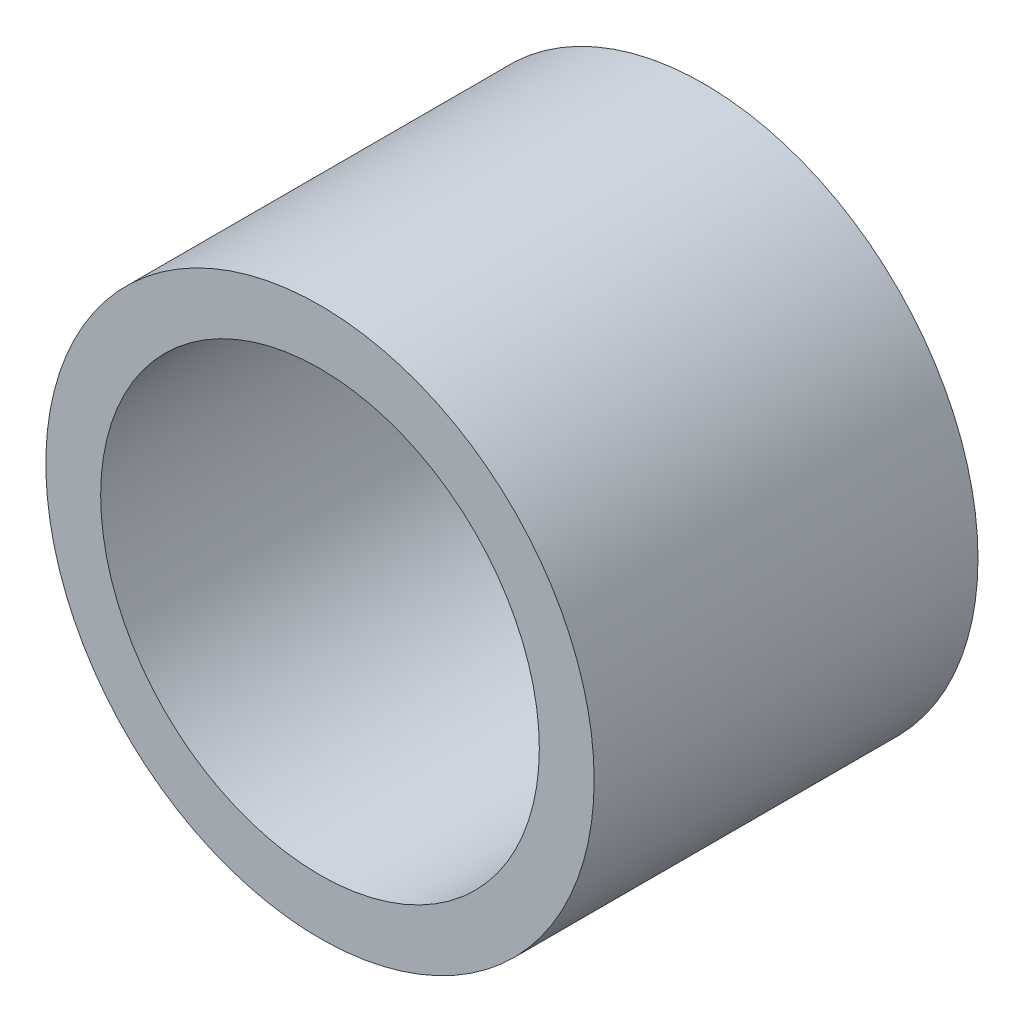
ISO-10303-21;
HEADER;
FILE_DESCRIPTION(('STEP AP214'),'2;1');
FILE_NAME('part.step','',(''),(''),'','','');
FILE_SCHEMA(('AUTOMOTIVE_DESIGN { 1 0 10303 214 1 1 1 1 }'));
ENDSEC;
DATA;
#1=APPLICATION_CONTEXT('core data for automotive mechanical design processes');
#2=APPLICATION_PROTOCOL_DEFINITION('international standard','automotive_design',2000,#1);
#3=PRODUCT_CONTEXT('',#1,'mechanical');
#4=PRODUCT('Part','Part','',(#3));
#5=PRODUCT_RELATED_PRODUCT_CATEGORY('part','',(#4));
#6=PRODUCT_DEFINITION_FORMATION('','',#4);
#7=PRODUCT_DEFINITION_CONTEXT('part definition',#1,'design');
#8=PRODUCT_DEFINITION('design','',#6,#7);
#9=PRODUCT_DEFINITION_SHAPE('','',#8);
#10=(LENGTH_UNIT() NAMED_UNIT(*) SI_UNIT(.MILLI.,.METRE.));
#11=(NAMED_UNIT(*) PLANE_ANGLE_UNIT() SI_UNIT($,.RADIAN.));
#12=(NAMED_UNIT(*) SI_UNIT($,.STERADIAN.) SOLID_ANGLE_UNIT());
#13=UNCERTAINTY_MEASURE_WITH_UNIT(LENGTH_MEASURE(1.E-05),#10,'distance_accuracy_value','');
#14=(GEOMETRIC_REPRESENTATION_CONTEXT(3) GLOBAL_UNCERTAINTY_ASSIGNED_CONTEXT((#13)) GLOBAL_UNIT_ASSIGNED_CONTEXT((#10,
#11,#12)) REPRESENTATION_CONTEXT('',''));
#15=CARTESIAN_POINT('',(0.,0.,0.));
#16=DIRECTION('',(0.,0.,1.));
#17=DIRECTION('',(1.,0.,0.));
#18=AXIS2_PLACEMENT_3D('',#15,#16,#17);
#19=CARTESIAN_POINT('',(0.,0.,7.));
#20=DIRECTION('',(0.,0.,1.));
#21=DIRECTION('',(1.,0.,0.));
#22=AXIS2_PLACEMENT_3D('',#19,#20,#21);
#23=PLANE('',#22);
#24=CARTESIAN_POINT('',(0.,0.,7.));
#25=DIRECTION('',(0.,0.,1.));
#26=DIRECTION('',(1.,0.,0.));
#27=AXIS2_PLACEMENT_3D('',#24,#25,#26);
#28=CIRCLE('',#27,5.);
#29=CARTESIAN_POINT('',(5.,0.,7.));
#30=VERTEX_POINT('',#29);
#31=EDGE_CURVE('E10',#30,#30,#28,.T.);
#32=ORIENTED_EDGE('',*,*,#31,.T.);
#33=EDGE_LOOP('',(#32));
#34=FACE_BOUND('',#33,.T.);
#35=CARTESIAN_POINT('',(0.,0.,7.));
#36=DIRECTION('',(0.,0.,1.));
#37=DIRECTION('',(1.,0.,0.));
#38=AXIS2_PLACEMENT_3D('',#35,#36,#37);
#39=CIRCLE('',#38,4.);
#40=CARTESIAN_POINT('',(4.,0.,7.));
#41=VERTEX_POINT('',#40);
#42=EDGE_CURVE('E57',#41,#41,#39,.T.);
#43=ORIENTED_EDGE('',*,*,#42,.F.);
#44=EDGE_LOOP('',(#43));
#45=FACE_BOUND('',#44,.T.);
#46=ADVANCED_FACE('F43',(#34,#45),#23,.T.);
#47=CARTESIAN_POINT('',(0.,0.,0.));
#48=DIRECTION('',(0.,0.,1.));
#49=DIRECTION('',(1.,0.,0.));
#50=AXIS2_PLACEMENT_3D('',#47,#48,#49);
#51=PLANE('',#50);
#52=CARTESIAN_POINT('',(0.,0.,0.));
#53=DIRECTION('',(0.,0.,1.));
#54=DIRECTION('',(1.,0.,0.));
#55=AXIS2_PLACEMENT_3D('',#52,#53,#54);
#56=CIRCLE('',#55,5.);
#57=CARTESIAN_POINT('',(5.,0.,0.));
#58=VERTEX_POINT('',#57);
#59=EDGE_CURVE('E50',#58,#58,#56,.T.);
#60=ORIENTED_EDGE('',*,*,#59,.F.);
#61=EDGE_LOOP('',(#60));
#62=FACE_BOUND('',#61,.T.);
#63=CARTESIAN_POINT('',(0.,0.,0.));
#64=DIRECTION('',(0.,0.,1.));
#65=DIRECTION('',(1.,0.,0.));
#66=AXIS2_PLACEMENT_3D('',#63,#64,#65);
#67=CIRCLE('',#66,4.);
#68=CARTESIAN_POINT('',(4.,0.,0.));
#69=VERTEX_POINT('',#68);
#70=EDGE_CURVE('E59',#69,#69,#67,.T.);
#71=ORIENTED_EDGE('',*,*,#70,.T.);
#72=EDGE_LOOP('',(#71));
#73=FACE_BOUND('',#72,.T.);
#74=ADVANCED_FACE('F68',(#62,#73),#51,.F.);
#75=CARTESIAN_POINT('',(0.,0.,7.));
#76=DIRECTION('',(0.,0.,-1.));
#77=DIRECTION('',(-1.,0.,0.));
#78=AXIS2_PLACEMENT_3D('',#75,#76,#77);
#79=CYLINDRICAL_SURFACE('',#78,5.);
#80=ORIENTED_EDGE('',*,*,#31,.F.);
#81=EDGE_LOOP('',(#80));
#82=FACE_BOUND('',#81,.T.);
#83=ORIENTED_EDGE('',*,*,#59,.T.);
#84=EDGE_LOOP('',(#83));
#85=FACE_BOUND('',#84,.T.);
#86=ADVANCED_FACE('F44',(#82,#85),#79,.T.);
#87=CARTESIAN_POINT('',(0.,0.,7.));
#88=DIRECTION('',(0.,0.,-1.));
#89=DIRECTION('',(-1.,0.,0.));
#90=AXIS2_PLACEMENT_3D('',#87,#88,#89);
#91=CYLINDRICAL_SURFACE('',#90,4.);
#92=ORIENTED_EDGE('',*,*,#42,.T.);
#93=EDGE_LOOP('',(#92));
#94=FACE_BOUND('',#93,.T.);
#95=ORIENTED_EDGE('',*,*,#70,.F.);
#96=EDGE_LOOP('',(#95));
#97=FACE_BOUND('',#96,.T.);
#98=ADVANCED_FACE('F67',(#94,#97),#91,.F.);
#99=CLOSED_SHELL('',(#46,#74,#86,#98));
#100=MANIFOLD_SOLID_BREP('B2',#99);
#101=ADVANCED_BREP_SHAPE_REPRESENTATION('',(#18,#100),#14);
#102=SHAPE_DEFINITION_REPRESENTATION(#9,#101);
ENDSEC;
END-ISO-10303-21;
